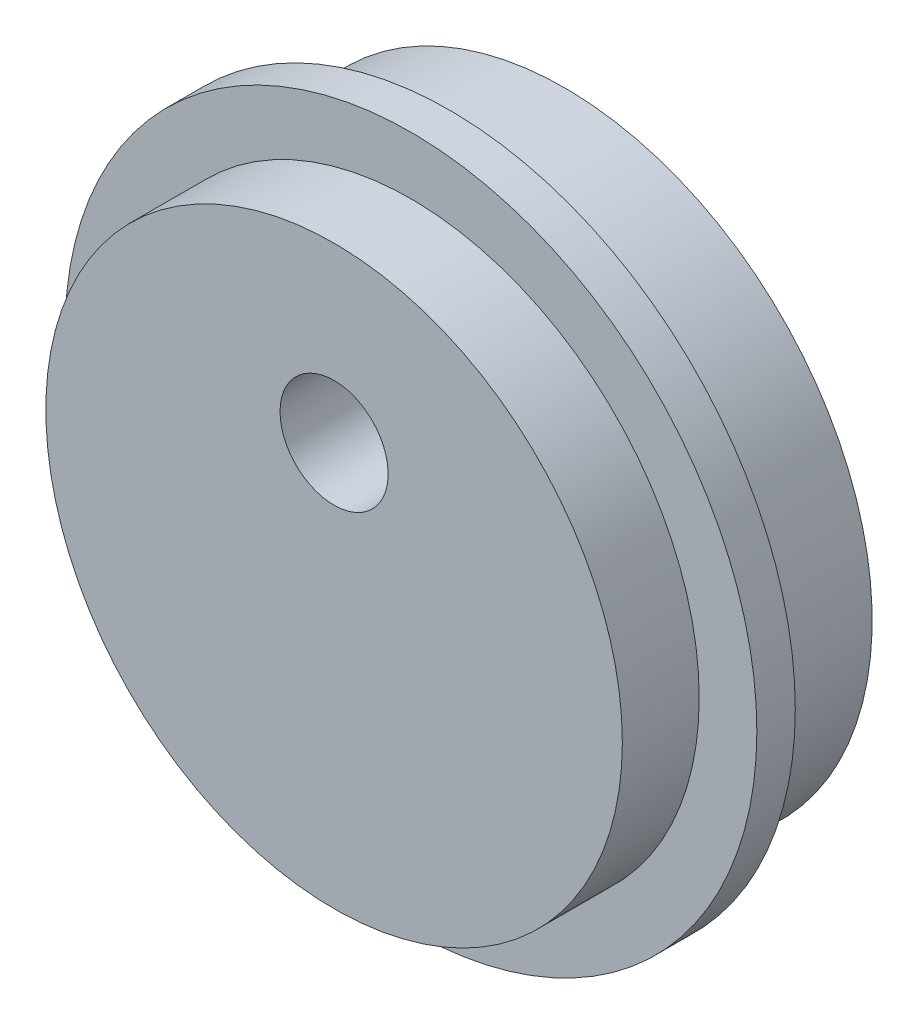
ISO-10303-21;
HEADER;
FILE_DESCRIPTION(('STEP AP214'),'2;1');
FILE_NAME('part.step','',(''),(''),'','','');
FILE_SCHEMA(('AUTOMOTIVE_DESIGN { 1 0 10303 214 1 1 1 1 }'));
ENDSEC;
DATA;
#1=APPLICATION_CONTEXT('core data for automotive mechanical design processes');
#2=APPLICATION_PROTOCOL_DEFINITION('international standard','automotive_design',2000,#1);
#3=PRODUCT_CONTEXT('',#1,'mechanical');
#4=PRODUCT('Part','Part','',(#3));
#5=PRODUCT_RELATED_PRODUCT_CATEGORY('part','',(#4));
#6=PRODUCT_DEFINITION_FORMATION('','',#4);
#7=PRODUCT_DEFINITION_CONTEXT('part definition',#1,'design');
#8=PRODUCT_DEFINITION('design','',#6,#7);
#9=PRODUCT_DEFINITION_SHAPE('','',#8);
#10=(LENGTH_UNIT() NAMED_UNIT(*) SI_UNIT(.MILLI.,.METRE.));
#11=(NAMED_UNIT(*) PLANE_ANGLE_UNIT() SI_UNIT($,.RADIAN.));
#12=(NAMED_UNIT(*) SI_UNIT($,.STERADIAN.) SOLID_ANGLE_UNIT());
#13=UNCERTAINTY_MEASURE_WITH_UNIT(LENGTH_MEASURE(1.E-05),#10,'distance_accuracy_value','');
#14=(GEOMETRIC_REPRESENTATION_CONTEXT(3) GLOBAL_UNCERTAINTY_ASSIGNED_CONTEXT((#13)) GLOBAL_UNIT_ASSIGNED_CONTEXT((#10,
#11,#12)) REPRESENTATION_CONTEXT('',''));
#15=CARTESIAN_POINT('',(0.,0.,0.));
#16=DIRECTION('',(0.,0.,1.));
#17=DIRECTION('',(1.,0.,0.));
#18=AXIS2_PLACEMENT_3D('',#15,#16,#17);
#19=CARTESIAN_POINT('',(0.,0.,25.4));
#20=DIRECTION('',(0.,0.,1.));
#21=DIRECTION('',(1.,0.,0.));
#22=AXIS2_PLACEMENT_3D('',#19,#20,#21);
#23=PLANE('',#22);
#24=CARTESIAN_POINT('',(0.,0.,25.4));
#25=DIRECTION('',(0.,0.,1.));
#26=DIRECTION('',(1.,0.,0.));
#27=AXIS2_PLACEMENT_3D('',#24,#25,#26);
#28=CIRCLE('',#27,47.625);
#29=CARTESIAN_POINT('',(47.6250000000001,0.,25.4));
#30=VERTEX_POINT('',#29);
#31=EDGE_CURVE('E62',#30,#30,#28,.T.);
#32=ORIENTED_EDGE('',*,*,#31,.F.);
#33=EDGE_LOOP('',(#32));
#34=FACE_BOUND('',#33,.T.);
#35=CARTESIAN_POINT('',(0.,0.,25.4));
#36=DIRECTION('',(0.,0.,1.));
#37=DIRECTION('',(1.,0.,0.));
#38=AXIS2_PLACEMENT_3D('',#35,#36,#37);
#39=CIRCLE('',#38,57.15);
#40=CARTESIAN_POINT('',(57.1500000000001,0.,25.4));
#41=VERTEX_POINT('',#40);
#42=EDGE_CURVE('E71',#41,#41,#39,.T.);
#43=ORIENTED_EDGE('',*,*,#42,.T.);
#44=EDGE_LOOP('',(#43));
#45=FACE_BOUND('',#44,.T.);
#46=ADVANCED_FACE('F50',(#34,#45),#23,.T.);
#47=CARTESIAN_POINT('',(0.,0.,25.4));
#48=DIRECTION('',(0.,0.,1.));
#49=DIRECTION('',(1.,0.,0.));
#50=AXIS2_PLACEMENT_3D('',#47,#48,#49);
#51=CYLINDRICAL_SURFACE('',#50,47.625);
#52=ORIENTED_EDGE('',*,*,#31,.T.);
#53=EDGE_LOOP('',(#52));
#54=FACE_BOUND('',#53,.T.);
#55=CARTESIAN_POINT('',(1.66533453693773E-13,0.,38.1));
#56=DIRECTION('',(0.,0.,1.));
#57=DIRECTION('',(1.,0.,0.));
#58=AXIS2_PLACEMENT_3D('',#55,#56,#57);
#59=CIRCLE('',#58,47.625);
#60=CARTESIAN_POINT('',(47.6250000000002,0.,38.1));
#61=VERTEX_POINT('',#60);
#62=EDGE_CURVE('E65',#61,#61,#59,.T.);
#63=ORIENTED_EDGE('',*,*,#62,.F.);
#64=EDGE_LOOP('',(#63));
#65=FACE_BOUND('',#64,.T.);
#66=ADVANCED_FACE('F96',(#54,#65),#51,.T.);
#67=CARTESIAN_POINT('',(1.66533453693773E-13,0.,38.1));
#68=DIRECTION('',(0.,0.,1.));
#69=DIRECTION('',(1.,0.,0.));
#70=AXIS2_PLACEMENT_3D('',#67,#68,#69);
#71=PLANE('',#70);
#72=CARTESIAN_POINT('',(0.,19.0500000000002,38.1));
#73=DIRECTION('',(0.,0.,-1.));
#74=DIRECTION('',(-1.,0.,0.));
#75=AXIS2_PLACEMENT_3D('',#72,#73,#74);
#76=CIRCLE('',#75,8.9296875);
#77=CARTESIAN_POINT('',(-8.92968749999996,19.0500000000002,38.1));
#78=VERTEX_POINT('',#77);
#79=EDGE_CURVE('E76',#78,#78,#76,.T.);
#80=ORIENTED_EDGE('',*,*,#79,.T.);
#81=EDGE_LOOP('',(#80));
#82=FACE_BOUND('',#81,.T.);
#83=ORIENTED_EDGE('',*,*,#62,.T.);
#84=EDGE_LOOP('',(#83));
#85=FACE_BOUND('',#84,.T.);
#86=ADVANCED_FACE('F102',(#82,#85),#71,.T.);
#87=CARTESIAN_POINT('',(0.,1.66533453693773E-13,19.05));
#88=DIRECTION('',(0.,0.,1.));
#89=DIRECTION('',(1.,0.,0.));
#90=AXIS2_PLACEMENT_3D('',#87,#88,#89);
#91=CYLINDRICAL_SURFACE('',#90,57.15);
#92=CARTESIAN_POINT('',(0.,1.66533453693773E-13,19.05));
#93=DIRECTION('',(0.,0.,1.));
#94=DIRECTION('',(1.,0.,0.));
#95=AXIS2_PLACEMENT_3D('',#92,#93,#94);
#96=CIRCLE('',#95,57.15);
#97=CARTESIAN_POINT('',(57.1500000000001,1.66533453693773E-13,19.05));
#98=VERTEX_POINT('',#97);
#99=EDGE_CURVE('E68',#98,#98,#96,.T.);
#100=ORIENTED_EDGE('',*,*,#99,.T.);
#101=EDGE_LOOP('',(#100));
#102=FACE_BOUND('',#101,.T.);
#103=ORIENTED_EDGE('',*,*,#42,.F.);
#104=EDGE_LOOP('',(#103));
#105=FACE_BOUND('',#104,.T.);
#106=ADVANCED_FACE('F110',(#102,#105),#91,.T.);
#107=CARTESIAN_POINT('',(0.,1.66533453693773E-13,19.05));
#108=DIRECTION('',(0.,0.,1.));
#109=DIRECTION('',(1.,0.,0.));
#110=AXIS2_PLACEMENT_3D('',#107,#108,#109);
#111=PLANE('',#110);
#112=CARTESIAN_POINT('',(0.,1.66533453693773E-13,19.05));
#113=DIRECTION('',(0.,0.,1.));
#114=DIRECTION('',(1.,0.,0.));
#115=AXIS2_PLACEMENT_3D('',#112,#113,#114);
#116=CIRCLE('',#115,50.8);
#117=CARTESIAN_POINT('',(-50.7999999999999,0.,19.05));
#118=VERTEX_POINT('',#117);
#119=EDGE_CURVE('E13',#118,#118,#116,.T.);
#120=ORIENTED_EDGE('',*,*,#119,.T.);
#121=EDGE_LOOP('',(#120));
#122=FACE_BOUND('',#121,.T.);
#123=ORIENTED_EDGE('',*,*,#99,.F.);
#124=EDGE_LOOP('',(#123));
#125=FACE_BOUND('',#124,.T.);
#126=ADVANCED_FACE('F112',(#122,#125),#111,.F.);
#127=CARTESIAN_POINT('',(0.,0.,0.));
#128=DIRECTION('',(0.,0.,1.));
#129=DIRECTION('',(1.,0.,0.));
#130=AXIS2_PLACEMENT_3D('',#127,#128,#129);
#131=PLANE('',#130);
#132=CARTESIAN_POINT('',(0.,19.0500000000002,0.));
#133=DIRECTION('',(0.,0.,1.));
#134=DIRECTION('',(1.,0.,0.));
#135=AXIS2_PLACEMENT_3D('',#132,#133,#134);
#136=CIRCLE('',#135,8.9296875);
#137=CARTESIAN_POINT('',(-8.92968749999996,19.0500000000002,0.));
#138=VERTEX_POINT('',#137);
#139=EDGE_CURVE('E54',#138,#138,#136,.T.);
#140=ORIENTED_EDGE('',*,*,#139,.T.);
#141=EDGE_LOOP('',(#140));
#142=FACE_BOUND('',#141,.T.);
#143=CARTESIAN_POINT('',(0.,0.,0.));
#144=DIRECTION('',(0.,0.,1.));
#145=DIRECTION('',(1.,0.,0.));
#146=AXIS2_PLACEMENT_3D('',#143,#144,#145);
#147=CIRCLE('',#146,50.8);
#148=CARTESIAN_POINT('',(-50.7999999999999,0.,0.));
#149=VERTEX_POINT('',#148);
#150=EDGE_CURVE('E58',#149,#149,#147,.T.);
#151=ORIENTED_EDGE('',*,*,#150,.F.);
#152=EDGE_LOOP('',(#151));
#153=FACE_BOUND('',#152,.T.);
#154=ADVANCED_FACE('F83',(#142,#153),#131,.F.);
#155=CARTESIAN_POINT('',(1.66533453693773E-13,0.,38.1));
#156=DIRECTION('',(0.,0.,-1.));
#157=DIRECTION('',(-1.,0.,0.));
#158=AXIS2_PLACEMENT_3D('',#155,#156,#157);
#159=CYLINDRICAL_SURFACE('',#158,50.8);
#160=CARTESIAN_POINT('',(-50.7999999999999,0.,0.));
#161=CARTESIAN_POINT('',(-50.7999999999999,0.,0.198437499999993));
#162=CARTESIAN_POINT('',(-50.7999999999999,0.,0.396874999999993));
#163=CARTESIAN_POINT('',(-50.7999999999999,0.,0.793749999999994));
#164=CARTESIAN_POINT('',(-50.7999999999999,0.,0.992187499999994));
#165=CARTESIAN_POINT('',(-50.7999999999999,0.,1.38906249999999));
#166=CARTESIAN_POINT('',(-50.7999999999999,0.,1.58749999999999));
#167=CARTESIAN_POINT('',(-50.7999999999999,0.,1.98437499999999));
#168=CARTESIAN_POINT('',(-50.7999999999999,0.,2.18281249999999));
#169=CARTESIAN_POINT('',(-50.7999999999999,0.,2.57968749999999));
#170=CARTESIAN_POINT('',(-50.7999999999999,0.,2.77812499999999));
#171=CARTESIAN_POINT('',(-50.7999999999999,0.,3.17499999999999));
#172=CARTESIAN_POINT('',(-50.7999999999999,0.,3.37343749999999));
#173=CARTESIAN_POINT('',(-50.7999999999999,0.,3.7703125));
#174=CARTESIAN_POINT('',(-50.7999999999999,0.,3.96875));
#175=CARTESIAN_POINT('',(-50.7999999999999,0.,4.365625));
#176=CARTESIAN_POINT('',(-50.7999999999999,0.,4.5640625));
#177=CARTESIAN_POINT('',(-50.7999999999999,0.,4.9609375));
#178=CARTESIAN_POINT('',(-50.7999999999999,0.,5.159375));
#179=CARTESIAN_POINT('',(-50.7999999999999,0.,5.55625));
#180=CARTESIAN_POINT('',(-50.7999999999999,0.,5.7546875));
#181=CARTESIAN_POINT('',(-50.7999999999999,0.,6.1515625));
#182=CARTESIAN_POINT('',(-50.7999999999999,0.,6.35));
#183=CARTESIAN_POINT('',(-50.7999999999999,0.,6.746875));
#184=CARTESIAN_POINT('',(-50.7999999999999,0.,6.9453125));
#185=CARTESIAN_POINT('',(-50.7999999999999,0.,7.3421875));
#186=CARTESIAN_POINT('',(-50.7999999999999,0.,7.540625));
#187=CARTESIAN_POINT('',(-50.7999999999999,0.,7.9375));
#188=CARTESIAN_POINT('',(-50.7999999999999,0.,8.1359375));
#189=CARTESIAN_POINT('',(-50.7999999999999,0.,8.5328125));
#190=CARTESIAN_POINT('',(-50.7999999999999,0.,8.73125));
#191=CARTESIAN_POINT('',(-50.7999999999999,0.,9.128125));
#192=CARTESIAN_POINT('',(-50.7999999999999,0.,9.3265625));
#193=CARTESIAN_POINT('',(-50.7999999999999,0.,9.7234375));
#194=CARTESIAN_POINT('',(-50.7999999999999,0.,9.921875));
#195=CARTESIAN_POINT('',(-50.7999999999999,0.,10.31875));
#196=CARTESIAN_POINT('',(-50.7999999999999,0.,10.5171875));
#197=CARTESIAN_POINT('',(-50.7999999999999,0.,10.9140625));
#198=CARTESIAN_POINT('',(-50.7999999999999,0.,11.1125));
#199=CARTESIAN_POINT('',(-50.7999999999999,0.,11.509375));
#200=CARTESIAN_POINT('',(-50.7999999999999,0.,11.7078125));
#201=CARTESIAN_POINT('',(-50.7999999999999,0.,12.1046875));
#202=CARTESIAN_POINT('',(-50.7999999999999,0.,12.303125));
#203=CARTESIAN_POINT('',(-50.7999999999999,0.,12.7));
#204=CARTESIAN_POINT('',(-50.7999999999999,0.,12.8984375));
#205=CARTESIAN_POINT('',(-50.7999999999999,0.,13.2953125));
#206=CARTESIAN_POINT('',(-50.7999999999999,0.,13.49375));
#207=CARTESIAN_POINT('',(-50.7999999999999,0.,13.890625));
#208=CARTESIAN_POINT('',(-50.7999999999999,0.,14.0890625));
#209=CARTESIAN_POINT('',(-50.7999999999999,0.,14.4859375));
#210=CARTESIAN_POINT('',(-50.7999999999999,0.,14.684375));
#211=CARTESIAN_POINT('',(-50.7999999999999,0.,15.08125));
#212=CARTESIAN_POINT('',(-50.7999999999999,0.,15.2796875));
#213=CARTESIAN_POINT('',(-50.7999999999999,0.,15.6765625));
#214=CARTESIAN_POINT('',(-50.7999999999999,0.,15.875));
#215=CARTESIAN_POINT('',(-50.7999999999999,0.,16.271875));
#216=CARTESIAN_POINT('',(-50.7999999999999,0.,16.4703125));
#217=CARTESIAN_POINT('',(-50.7999999999999,0.,16.8671875));
#218=CARTESIAN_POINT('',(-50.7999999999999,0.,17.065625));
#219=CARTESIAN_POINT('',(-50.7999999999999,0.,17.4625));
#220=CARTESIAN_POINT('',(-50.7999999999999,0.,17.6609375));
#221=CARTESIAN_POINT('',(-50.7999999999999,0.,18.0578125));
#222=CARTESIAN_POINT('',(-50.7999999999999,0.,18.25625));
#223=CARTESIAN_POINT('',(-50.7999999999999,0.,18.653125));
#224=CARTESIAN_POINT('',(-50.7999999999999,0.,18.8515625));
#225=CARTESIAN_POINT('',(-50.7999999999999,0.,19.05));
#226=B_SPLINE_CURVE_WITH_KNOTS('',3,(#160,#161,#162,#163,#164,#165,#166,#167,#168,#169,#170,
#171,#172,#173,#174,#175,#176,#177,#178,#179,#180,#181,#182,#183,#184,#185,#186,#187,#188,#189,
#190,#191,#192,#193,#194,#195,#196,#197,#198,#199,#200,#201,#202,#203,#204,#205,#206,#207,#208,
#209,#210,#211,#212,#213,#214,#215,#216,#217,#218,#219,#220,#221,#222,#223,#224,#225),
.UNSPECIFIED.,.F.,.F.,(4,2,2,2,2,2,2,2,2,2,2,2,2,2,2,2,2,2,2,2,2,2,2,2,2,2,2,2,2,2,2,2,4),(0.,
0.5953125,1.190625,1.7859375,2.38125,2.9765625,3.571875,4.1671875,4.7625,5.3578125,5.953125,
6.5484375,7.14375,7.7390625,8.334375,8.92968750000001,9.52500000000001,10.1203125,10.715625,
11.3109375,11.90625,12.5015625,13.096875,13.6921875,14.2875,14.8828125,15.478125,16.0734375,
16.66875,17.2640625,17.859375,18.4546875,19.05),.UNSPECIFIED.);
#227=EDGE_CURVE('BSEAM52',#149,#118,#226,.T.);
#228=ORIENTED_EDGE('',*,*,#150,.T.);
#229=ORIENTED_EDGE('',*,*,#119,.F.);
#230=ORIENTED_EDGE('',*,*,#227,.T.);
#231=ORIENTED_EDGE('',*,*,#227,.F.);
#232=EDGE_LOOP('',(#228,#230,#229,#231));
#233=FACE_BOUND('',#232,.T.);
#234=ADVANCED_FACE('F52',(#233),#159,.T.);
#235=CARTESIAN_POINT('',(0.,19.0500000000002,38.1));
#236=DIRECTION('',(0.,0.,-1.));
#237=DIRECTION('',(-1.,0.,0.));
#238=AXIS2_PLACEMENT_3D('',#235,#236,#237);
#239=CYLINDRICAL_SURFACE('',#238,8.9296875);
#240=CARTESIAN_POINT('',(-8.92968749999996,19.0500000000002,38.1));
#241=CARTESIAN_POINT('',(-8.92968749999996,19.0500000000002,37.703125));
#242=CARTESIAN_POINT('',(-8.92968749999996,19.0500000000002,37.30625));
#243=CARTESIAN_POINT('',(-8.92968749999996,19.0500000000002,36.5125));
#244=CARTESIAN_POINT('',(-8.92968749999996,19.0500000000002,36.115625));
#245=CARTESIAN_POINT('',(-8.92968749999996,19.0500000000002,35.321875));
#246=CARTESIAN_POINT('',(-8.92968749999996,19.0500000000002,34.925));
#247=CARTESIAN_POINT('',(-8.92968749999996,19.0500000000002,34.13125));
#248=CARTESIAN_POINT('',(-8.92968749999996,19.0500000000002,33.734375));
#249=CARTESIAN_POINT('',(-8.92968749999996,19.0500000000002,32.940625));
#250=CARTESIAN_POINT('',(-8.92968749999996,19.0500000000002,32.54375));
#251=CARTESIAN_POINT('',(-8.92968749999996,19.0500000000002,31.75));
#252=CARTESIAN_POINT('',(-8.92968749999996,19.0500000000002,31.353125));
#253=CARTESIAN_POINT('',(-8.92968749999996,19.0500000000002,30.559375));
#254=CARTESIAN_POINT('',(-8.92968749999996,19.0500000000002,30.1625));
#255=CARTESIAN_POINT('',(-8.92968749999996,19.0500000000002,29.36875));
#256=CARTESIAN_POINT('',(-8.92968749999996,19.0500000000002,28.971875));
#257=CARTESIAN_POINT('',(-8.92968749999996,19.0500000000002,28.178125));
#258=CARTESIAN_POINT('',(-8.92968749999996,19.0500000000002,27.78125));
#259=CARTESIAN_POINT('',(-8.92968749999996,19.0500000000002,26.9875));
#260=CARTESIAN_POINT('',(-8.92968749999996,19.0500000000002,26.590625));
#261=CARTESIAN_POINT('',(-8.92968749999996,19.0500000000002,25.796875));
#262=CARTESIAN_POINT('',(-8.92968749999996,19.0500000000002,25.4));
#263=CARTESIAN_POINT('',(-8.92968749999996,19.0500000000002,24.60625));
#264=CARTESIAN_POINT('',(-8.92968749999996,19.0500000000002,24.209375));
#265=CARTESIAN_POINT('',(-8.92968749999996,19.0500000000002,23.415625));
#266=CARTESIAN_POINT('',(-8.92968749999996,19.0500000000002,23.01875));
#267=CARTESIAN_POINT('',(-8.92968749999996,19.0500000000002,22.225));
#268=CARTESIAN_POINT('',(-8.92968749999996,19.0500000000002,21.828125));
#269=CARTESIAN_POINT('',(-8.92968749999996,19.0500000000002,21.034375));
#270=CARTESIAN_POINT('',(-8.92968749999996,19.0500000000002,20.6375));
#271=CARTESIAN_POINT('',(-8.92968749999996,19.0500000000002,19.84375));
#272=CARTESIAN_POINT('',(-8.92968749999996,19.0500000000002,19.446875));
#273=CARTESIAN_POINT('',(-8.92968749999996,19.0500000000002,18.653125));
#274=CARTESIAN_POINT('',(-8.92968749999996,19.0500000000002,18.25625));
#275=CARTESIAN_POINT('',(-8.92968749999996,19.0500000000002,17.4625));
#276=CARTESIAN_POINT('',(-8.92968749999996,19.0500000000002,17.065625));
#277=CARTESIAN_POINT('',(-8.92968749999996,19.0500000000002,16.271875));
#278=CARTESIAN_POINT('',(-8.92968749999996,19.0500000000002,15.875));
#279=CARTESIAN_POINT('',(-8.92968749999996,19.0500000000002,15.08125));
#280=CARTESIAN_POINT('',(-8.92968749999996,19.0500000000002,14.684375));
#281=CARTESIAN_POINT('',(-8.92968749999996,19.0500000000002,13.890625));
#282=CARTESIAN_POINT('',(-8.92968749999996,19.0500000000002,13.49375));
#283=CARTESIAN_POINT('',(-8.92968749999996,19.0500000000002,12.7));
#284=CARTESIAN_POINT('',(-8.92968749999996,19.0500000000002,12.303125));
#285=CARTESIAN_POINT('',(-8.92968749999996,19.0500000000002,11.509375));
#286=CARTESIAN_POINT('',(-8.92968749999996,19.0500000000002,11.1125));
#287=CARTESIAN_POINT('',(-8.92968749999996,19.0500000000002,10.31875));
#288=CARTESIAN_POINT('',(-8.92968749999996,19.0500000000002,9.92187499999999));
#289=CARTESIAN_POINT('',(-8.92968749999996,19.0500000000002,9.12812499999999));
#290=CARTESIAN_POINT('',(-8.92968749999996,19.0500000000002,8.73124999999999));
#291=CARTESIAN_POINT('',(-8.92968749999996,19.0500000000002,7.93749999999999));
#292=CARTESIAN_POINT('',(-8.92968749999996,19.0500000000002,7.54062499999999));
#293=CARTESIAN_POINT('',(-8.92968749999996,19.0500000000002,6.74687499999999));
#294=CARTESIAN_POINT('',(-8.92968749999996,19.0500000000002,6.34999999999999));
#295=CARTESIAN_POINT('',(-8.92968749999996,19.0500000000002,5.55625));
#296=CARTESIAN_POINT('',(-8.92968749999996,19.0500000000002,5.159375));
#297=CARTESIAN_POINT('',(-8.92968749999996,19.0500000000002,4.365625));
#298=CARTESIAN_POINT('',(-8.92968749999996,19.0500000000002,3.96875));
#299=CARTESIAN_POINT('',(-8.92968749999996,19.0500000000002,3.17499999999999));
#300=CARTESIAN_POINT('',(-8.92968749999996,19.0500000000002,2.77812499999999));
#301=CARTESIAN_POINT('',(-8.92968749999996,19.0500000000002,1.98437499999999));
#302=CARTESIAN_POINT('',(-8.92968749999996,19.0500000000002,1.58749999999999));
#303=CARTESIAN_POINT('',(-8.92968749999996,19.0500000000002,0.793749999999994));
#304=CARTESIAN_POINT('',(-8.92968749999996,19.0500000000002,0.396874999999993));
#305=CARTESIAN_POINT('',(-8.92968749999996,19.0500000000002,0.));
#306=B_SPLINE_CURVE_WITH_KNOTS('',3,(#240,#241,#242,#243,#244,#245,#246,#247,#248,#249,#250,
#251,#252,#253,#254,#255,#256,#257,#258,#259,#260,#261,#262,#263,#264,#265,#266,#267,#268,#269,
#270,#271,#272,#273,#274,#275,#276,#277,#278,#279,#280,#281,#282,#283,#284,#285,#286,#287,#288,
#289,#290,#291,#292,#293,#294,#295,#296,#297,#298,#299,#300,#301,#302,#303,#304,#305),
.UNSPECIFIED.,.F.,.F.,(4,2,2,2,2,2,2,2,2,2,2,2,2,2,2,2,2,2,2,2,2,2,2,2,2,2,2,2,2,2,2,2,4),(0.,
1.190625,2.38125,3.571875,4.7625,5.953125,7.14375,8.334375,9.52500000000001,10.715625,11.90625,
13.096875,14.2875,15.478125,16.66875,17.859375,19.05,20.240625,21.43125,22.621875,23.8125,
25.003125,26.19375,27.384375,28.575,29.765625,30.95625,32.146875,33.3375,34.528125,35.71875,
36.909375,38.1),.UNSPECIFIED.);
#307=EDGE_CURVE('BSEAM86',#78,#138,#306,.T.);
#308=ORIENTED_EDGE('',*,*,#79,.F.);
#309=ORIENTED_EDGE('',*,*,#139,.F.);
#310=ORIENTED_EDGE('',*,*,#307,.T.);
#311=ORIENTED_EDGE('',*,*,#307,.F.);
#312=EDGE_LOOP('',(#308,#310,#309,#311));
#313=FACE_BOUND('',#312,.T.);
#314=ADVANCED_FACE('F86',(#313),#239,.F.);
#315=CLOSED_SHELL('',(#46,#66,#86,#106,#126,#154,#234,#314));
#316=MANIFOLD_SOLID_BREP('B2',#315);
#317=ADVANCED_BREP_SHAPE_REPRESENTATION('',(#18,#316),#14);
#318=SHAPE_DEFINITION_REPRESENTATION(#9,#317);
ENDSEC;
END-ISO-10303-21;
